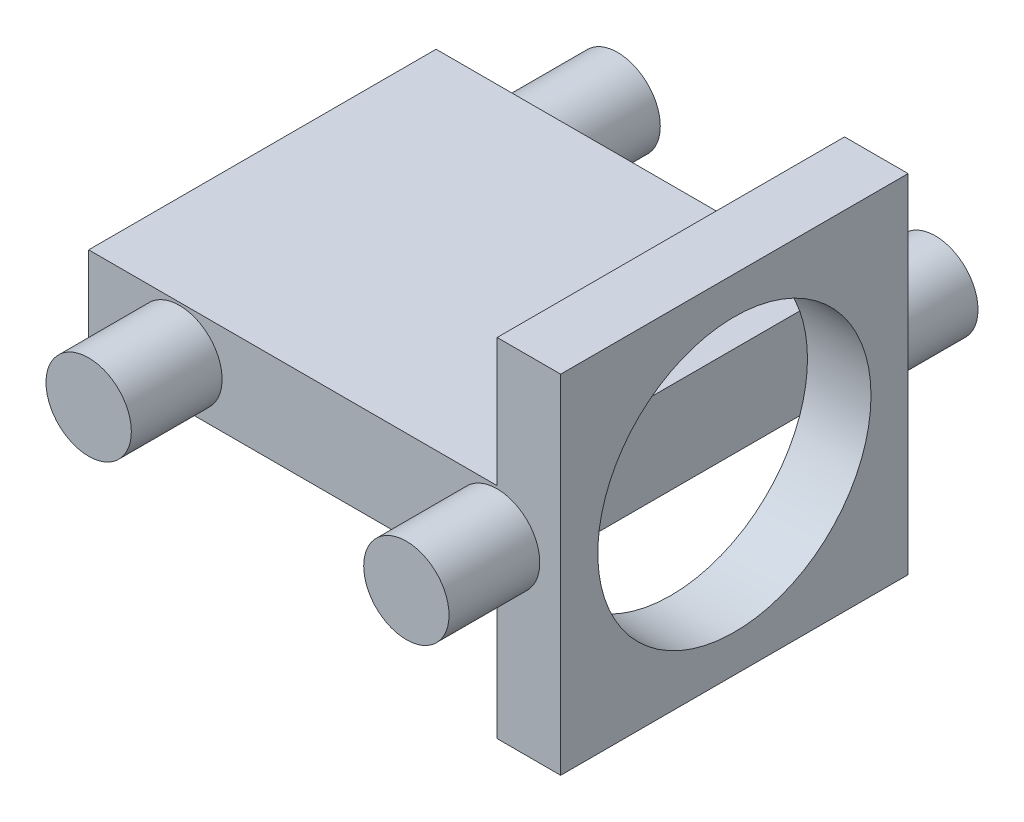
ISO-10303-21;
HEADER;
FILE_DESCRIPTION(('STEP AP214'),'2;1');
FILE_NAME('part.step','',(''),(''),'','','');
FILE_SCHEMA(('AUTOMOTIVE_DESIGN { 1 0 10303 214 1 1 1 1 }'));
ENDSEC;
DATA;
#1=APPLICATION_CONTEXT('core data for automotive mechanical design processes');
#2=APPLICATION_PROTOCOL_DEFINITION('international standard','automotive_design',2000,#1);
#3=PRODUCT_CONTEXT('',#1,'mechanical');
#4=PRODUCT('Part','Part','',(#3));
#5=PRODUCT_RELATED_PRODUCT_CATEGORY('part','',(#4));
#6=PRODUCT_DEFINITION_FORMATION('','',#4);
#7=PRODUCT_DEFINITION_CONTEXT('part definition',#1,'design');
#8=PRODUCT_DEFINITION('design','',#6,#7);
#9=PRODUCT_DEFINITION_SHAPE('','',#8);
#10=(LENGTH_UNIT() NAMED_UNIT(*) SI_UNIT(.MILLI.,.METRE.));
#11=(NAMED_UNIT(*) PLANE_ANGLE_UNIT() SI_UNIT($,.RADIAN.));
#12=(NAMED_UNIT(*) SI_UNIT($,.STERADIAN.) SOLID_ANGLE_UNIT());
#13=UNCERTAINTY_MEASURE_WITH_UNIT(LENGTH_MEASURE(1.E-05),#10,'distance_accuracy_value','');
#14=(GEOMETRIC_REPRESENTATION_CONTEXT(3) GLOBAL_UNCERTAINTY_ASSIGNED_CONTEXT((#13)) GLOBAL_UNIT_ASSIGNED_CONTEXT((#10,
#11,#12)) REPRESENTATION_CONTEXT('',''));
#15=CARTESIAN_POINT('',(0.,0.,0.));
#16=DIRECTION('',(0.,0.,1.));
#17=DIRECTION('',(1.,0.,0.));
#18=AXIS2_PLACEMENT_3D('',#15,#16,#17);
#19=CARTESIAN_POINT('',(0.,0.,0.));
#20=DIRECTION('',(-1.,0.,0.));
#21=DIRECTION('',(0.,0.,1.));
#22=AXIS2_PLACEMENT_3D('',#19,#20,#21);
#23=PLANE('',#22);
#24=DIRECTION('',(0.,0.,1.));
#25=VECTOR('',#24,1.);
#26=CARTESIAN_POINT('',(0.,-5.,-19.1375));
#27=LINE('',#26,#25);
#28=CARTESIAN_POINT('',(0.,-5.,-19.1375));
#29=VERTEX_POINT('',#28);
#30=CARTESIAN_POINT('',(0.,-5.,-14.1951576250495));
#31=VERTEX_POINT('',#30);
#32=EDGE_CURVE('E147',#29,#31,#27,.T.);
#33=ORIENTED_EDGE('',*,*,#32,.F.);
#34=DIRECTION('',(0.,1.,0.));
#35=VECTOR('',#34,1.);
#36=CARTESIAN_POINT('',(0.,-19.1375,-19.1375));
#37=LINE('',#36,#35);
#38=CARTESIAN_POINT('',(0.,-19.1375,-19.1375));
#39=VERTEX_POINT('',#38);
#40=EDGE_CURVE('E187',#39,#29,#37,.T.);
#41=ORIENTED_EDGE('',*,*,#40,.F.);
#42=DIRECTION('',(0.,0.,-1.));
#43=VECTOR('',#42,1.);
#44=CARTESIAN_POINT('',(0.,-19.1375,19.1375));
#45=LINE('',#44,#43);
#46=CARTESIAN_POINT('',(0.,-19.1375,19.1375));
#47=VERTEX_POINT('',#46);
#48=EDGE_CURVE('E177',#47,#39,#45,.T.);
#49=ORIENTED_EDGE('',*,*,#48,.F.);
#50=DIRECTION('',(0.,-1.,0.));
#51=VECTOR('',#50,1.);
#52=CARTESIAN_POINT('',(0.,-19.1375,19.1375));
#53=LINE('',#52,#51);
#54=CARTESIAN_POINT('',(0.,-5.,19.1375));
#55=VERTEX_POINT('',#54);
#56=EDGE_CURVE('E194',#55,#47,#53,.T.);
#57=ORIENTED_EDGE('',*,*,#56,.F.);
#58=CARTESIAN_POINT('',(0.,-5.,14.1951576250495));
#59=VERTEX_POINT('',#58);
#60=EDGE_CURVE('E68',#59,#55,#27,.T.);
#61=ORIENTED_EDGE('',*,*,#60,.F.);
#62=CARTESIAN_POINT('',(0.,0.,0.));
#63=DIRECTION('',(1.,0.,0.));
#64=DIRECTION('',(0.,0.,-1.));
#65=AXIS2_PLACEMENT_3D('',#62,#63,#64);
#66=CIRCLE('',#65,15.05);
#67=EDGE_CURVE('E158',#59,#31,#66,.T.);
#68=ORIENTED_EDGE('',*,*,#67,.T.);
#69=EDGE_LOOP('',(#33,#41,#49,#57,#61,#68));
#70=FACE_BOUND('',#69,.T.);
#71=ADVANCED_FACE('F45',(#70),#23,.T.);
#72=CARTESIAN_POINT('',(7.,0.,0.));
#73=DIRECTION('',(-1.,0.,0.));
#74=DIRECTION('',(0.,0.,1.));
#75=AXIS2_PLACEMENT_3D('',#72,#73,#74);
#76=PLANE('',#75);
#77=DIRECTION('',(0.,1.,0.));
#78=VECTOR('',#77,1.);
#79=CARTESIAN_POINT('',(7.,-19.1375,-19.1375));
#80=LINE('',#79,#78);
#81=CARTESIAN_POINT('',(7.,-19.1375,-19.1375));
#82=VERTEX_POINT('',#81);
#83=CARTESIAN_POINT('',(7.,19.1375,-19.1375));
#84=VERTEX_POINT('',#83);
#85=EDGE_CURVE('E172',#82,#84,#80,.T.);
#86=ORIENTED_EDGE('',*,*,#85,.T.);
#87=DIRECTION('',(0.,0.,1.));
#88=VECTOR('',#87,1.);
#89=CARTESIAN_POINT('',(7.,19.1375,19.1375));
#90=LINE('',#89,#88);
#91=CARTESIAN_POINT('',(7.,19.1375,19.1375));
#92=VERTEX_POINT('',#91);
#93=EDGE_CURVE('E176',#84,#92,#90,.T.);
#94=ORIENTED_EDGE('',*,*,#93,.T.);
#95=DIRECTION('',(0.,-1.,0.));
#96=VECTOR('',#95,1.);
#97=CARTESIAN_POINT('',(7.,-19.1375,19.1375));
#98=LINE('',#97,#96);
#99=CARTESIAN_POINT('',(7.,-19.1375,19.1375));
#100=VERTEX_POINT('',#99);
#101=EDGE_CURVE('E180',#92,#100,#98,.T.);
#102=ORIENTED_EDGE('',*,*,#101,.T.);
#103=DIRECTION('',(0.,0.,-1.));
#104=VECTOR('',#103,1.);
#105=CARTESIAN_POINT('',(7.,-19.1375,19.1375));
#106=LINE('',#105,#104);
#107=EDGE_CURVE('E183',#100,#82,#106,.T.);
#108=ORIENTED_EDGE('',*,*,#107,.T.);
#109=EDGE_LOOP('',(#86,#94,#102,#108));
#110=FACE_BOUND('',#109,.T.);
#111=CARTESIAN_POINT('',(7.,0.,0.));
#112=DIRECTION('',(1.,0.,0.));
#113=DIRECTION('',(0.,0.,-1.));
#114=AXIS2_PLACEMENT_3D('',#111,#112,#113);
#115=CIRCLE('',#114,15.05);
#116=CARTESIAN_POINT('',(7.,0.,-15.05));
#117=VERTEX_POINT('',#116);
#118=EDGE_CURVE('E165',#117,#117,#115,.T.);
#119=ORIENTED_EDGE('',*,*,#118,.F.);
#120=EDGE_LOOP('',(#119));
#121=FACE_BOUND('',#120,.T.);
#122=ADVANCED_FACE('F277',(#110,#121),#76,.F.);
#123=DIRECTION('',(0.,0.,-1.));
#124=VECTOR('',#123,1.);
#125=CARTESIAN_POINT('',(0.,5.,-19.1375));
#126=LINE('',#125,#124);
#127=CARTESIAN_POINT('',(0.,5.,19.1375));
#128=VERTEX_POINT('',#127);
#129=CARTESIAN_POINT('',(0.,5.,14.1951576250495));
#130=VERTEX_POINT('',#129);
#131=EDGE_CURVE('E224',#128,#130,#126,.T.);
#132=ORIENTED_EDGE('',*,*,#131,.F.);
#133=CARTESIAN_POINT('',(0.,19.1375,19.1375));
#134=VERTEX_POINT('',#133);
#135=EDGE_CURVE('E153',#134,#128,#53,.T.);
#136=ORIENTED_EDGE('',*,*,#135,.F.);
#137=DIRECTION('',(0.,0.,1.));
#138=VECTOR('',#137,1.);
#139=CARTESIAN_POINT('',(0.,19.1375,19.1375));
#140=LINE('',#139,#138);
#141=CARTESIAN_POINT('',(0.,19.1375,-19.1375));
#142=VERTEX_POINT('',#141);
#143=EDGE_CURVE('E191',#142,#134,#140,.T.);
#144=ORIENTED_EDGE('',*,*,#143,.F.);
#145=CARTESIAN_POINT('',(0.,5.,-19.1375));
#146=VERTEX_POINT('',#145);
#147=EDGE_CURVE('E168',#146,#142,#37,.T.);
#148=ORIENTED_EDGE('',*,*,#147,.F.);
#149=CARTESIAN_POINT('',(0.,5.,-14.1951576250495));
#150=VERTEX_POINT('',#149);
#151=EDGE_CURVE('E212',#150,#146,#126,.T.);
#152=ORIENTED_EDGE('',*,*,#151,.F.);
#153=EDGE_CURVE('E160',#150,#130,#66,.T.);
#154=ORIENTED_EDGE('',*,*,#153,.T.);
#155=EDGE_LOOP('',(#132,#136,#144,#148,#152,#154));
#156=FACE_BOUND('',#155,.T.);
#157=ADVANCED_FACE('F279',(#156),#23,.T.);
#158=CARTESIAN_POINT('',(7.,-19.1375,-19.1375));
#159=DIRECTION('',(0.,0.,1.));
#160=DIRECTION('',(1.,0.,0.));
#161=AXIS2_PLACEMENT_3D('',#158,#159,#160);
#162=PLANE('',#161);
#163=CARTESIAN_POINT('',(0.,0.,-19.1375));
#164=DIRECTION('',(0.,0.,1.));
#165=DIRECTION('',(1.,0.,0.));
#166=AXIS2_PLACEMENT_3D('',#163,#164,#165);
#167=CIRCLE('',#166,4.7);
#168=CARTESIAN_POINT('',(4.7,0.,-19.1375));
#169=VERTEX_POINT('',#168);
#170=EDGE_CURVE('E257',#169,#169,#167,.T.);
#171=ORIENTED_EDGE('',*,*,#170,.T.);
#172=EDGE_LOOP('',(#171));
#173=FACE_BOUND('',#172,.T.);
#174=CARTESIAN_POINT('',(-35.,0.,-19.1375));
#175=DIRECTION('',(0.,0.,1.));
#176=DIRECTION('',(1.,0.,0.));
#177=AXIS2_PLACEMENT_3D('',#174,#175,#176);
#178=CIRCLE('',#177,4.7);
#179=CARTESIAN_POINT('',(-30.3,0.,-19.1375));
#180=VERTEX_POINT('',#179);
#181=EDGE_CURVE('E249',#180,#180,#178,.T.);
#182=ORIENTED_EDGE('',*,*,#181,.T.);
#183=EDGE_LOOP('',(#182));
#184=FACE_BOUND('',#183,.T.);
#185=ORIENTED_EDGE('',*,*,#40,.T.);
#186=DIRECTION('',(1.,0.,0.));
#187=VECTOR('',#186,1.);
#188=CARTESIAN_POINT('',(-45.,-5.,-19.1375));
#189=LINE('',#188,#187);
#190=CARTESIAN_POINT('',(-45.,-5.,-19.1375));
#191=VERTEX_POINT('',#190);
#192=EDGE_CURVE('E161',#191,#29,#189,.T.);
#193=ORIENTED_EDGE('',*,*,#192,.F.);
#194=DIRECTION('',(0.,-1.,0.));
#195=VECTOR('',#194,1.);
#196=CARTESIAN_POINT('',(-45.,-5.,-19.1375));
#197=LINE('',#196,#195);
#198=CARTESIAN_POINT('',(-45.,5.,-19.1375));
#199=VERTEX_POINT('',#198);
#200=EDGE_CURVE('E136',#199,#191,#197,.T.);
#201=ORIENTED_EDGE('',*,*,#200,.F.);
#202=DIRECTION('',(1.,0.,0.));
#203=VECTOR('',#202,1.);
#204=CARTESIAN_POINT('',(-45.,5.,-19.1375));
#205=LINE('',#204,#203);
#206=EDGE_CURVE('E132',#199,#146,#205,.T.);
#207=ORIENTED_EDGE('',*,*,#206,.T.);
#208=ORIENTED_EDGE('',*,*,#147,.T.);
#209=DIRECTION('',(-1.,0.,0.));
#210=VECTOR('',#209,1.);
#211=CARTESIAN_POINT('',(7.,19.1375,-19.1375));
#212=LINE('',#211,#210);
#213=EDGE_CURVE('E209',#84,#142,#212,.T.);
#214=ORIENTED_EDGE('',*,*,#213,.F.);
#215=ORIENTED_EDGE('',*,*,#85,.F.);
#216=DIRECTION('',(-1.,0.,0.));
#217=VECTOR('',#216,1.);
#218=CARTESIAN_POINT('',(7.,-19.1375,-19.1375));
#219=LINE('',#218,#217);
#220=EDGE_CURVE('E186',#82,#39,#219,.T.);
#221=ORIENTED_EDGE('',*,*,#220,.T.);
#222=EDGE_LOOP('',(#185,#193,#201,#207,#208,#214,#215,#221));
#223=FACE_BOUND('',#222,.T.);
#224=ADVANCED_FACE('F47',(#173,#184,#223),#162,.F.);
#225=CARTESIAN_POINT('',(7.,19.1375,19.1375));
#226=DIRECTION('',(0.,-1.,0.));
#227=DIRECTION('',(0.,0.,-1.));
#228=AXIS2_PLACEMENT_3D('',#225,#226,#227);
#229=PLANE('',#228);
#230=ORIENTED_EDGE('',*,*,#143,.T.);
#231=DIRECTION('',(-1.,0.,0.));
#232=VECTOR('',#231,1.);
#233=CARTESIAN_POINT('',(7.,19.1375,19.1375));
#234=LINE('',#233,#232);
#235=EDGE_CURVE('E206',#92,#134,#234,.T.);
#236=ORIENTED_EDGE('',*,*,#235,.F.);
#237=ORIENTED_EDGE('',*,*,#93,.F.);
#238=ORIENTED_EDGE('',*,*,#213,.T.);
#239=EDGE_LOOP('',(#230,#236,#237,#238));
#240=FACE_BOUND('',#239,.T.);
#241=ADVANCED_FACE('F293',(#240),#229,.F.);
#242=CARTESIAN_POINT('',(7.,-19.1375,19.1375));
#243=DIRECTION('',(0.,0.,-1.));
#244=DIRECTION('',(-1.,0.,0.));
#245=AXIS2_PLACEMENT_3D('',#242,#243,#244);
#246=PLANE('',#245);
#247=CARTESIAN_POINT('',(0.,0.,19.1375));
#248=DIRECTION('',(0.,0.,-1.));
#249=DIRECTION('',(-1.,0.,0.));
#250=AXIS2_PLACEMENT_3D('',#247,#248,#249);
#251=CIRCLE('',#250,4.7);
#252=CARTESIAN_POINT('',(-4.7,0.,19.1375));
#253=VERTEX_POINT('',#252);
#254=EDGE_CURVE('E11',#253,#253,#251,.F.);
#255=ORIENTED_EDGE('',*,*,#254,.F.);
#256=EDGE_LOOP('',(#255));
#257=FACE_BOUND('',#256,.T.);
#258=CARTESIAN_POINT('',(-35.,0.,19.1375));
#259=DIRECTION('',(0.,0.,-1.));
#260=DIRECTION('',(-1.,0.,0.));
#261=AXIS2_PLACEMENT_3D('',#258,#259,#260);
#262=CIRCLE('',#261,4.7);
#263=CARTESIAN_POINT('',(-39.7,0.,19.1375));
#264=VERTEX_POINT('',#263);
#265=EDGE_CURVE('E54',#264,#264,#262,.F.);
#266=ORIENTED_EDGE('',*,*,#265,.F.);
#267=EDGE_LOOP('',(#266));
#268=FACE_BOUND('',#267,.T.);
#269=ORIENTED_EDGE('',*,*,#135,.T.);
#270=DIRECTION('',(1.,0.,0.));
#271=VECTOR('',#270,1.);
#272=CARTESIAN_POINT('',(-45.,5.,19.1375));
#273=LINE('',#272,#271);
#274=CARTESIAN_POINT('',(-45.,5.,19.1375));
#275=VERTEX_POINT('',#274);
#276=EDGE_CURVE('E129',#275,#128,#273,.T.);
#277=ORIENTED_EDGE('',*,*,#276,.F.);
#278=DIRECTION('',(0.,1.,0.));
#279=VECTOR('',#278,1.);
#280=CARTESIAN_POINT('',(-45.,-5.,19.1375));
#281=LINE('',#280,#279);
#282=CARTESIAN_POINT('',(-45.,-5.,19.1375));
#283=VERTEX_POINT('',#282);
#284=EDGE_CURVE('E137',#283,#275,#281,.T.);
#285=ORIENTED_EDGE('',*,*,#284,.F.);
#286=DIRECTION('',(1.,0.,0.));
#287=VECTOR('',#286,1.);
#288=CARTESIAN_POINT('',(-45.,-5.,19.1375));
#289=LINE('',#288,#287);
#290=EDGE_CURVE('E238',#283,#55,#289,.T.);
#291=ORIENTED_EDGE('',*,*,#290,.T.);
#292=ORIENTED_EDGE('',*,*,#56,.T.);
#293=DIRECTION('',(-1.,0.,0.));
#294=VECTOR('',#293,1.);
#295=CARTESIAN_POINT('',(7.,-19.1375,19.1375));
#296=LINE('',#295,#294);
#297=EDGE_CURVE('E202',#100,#47,#296,.T.);
#298=ORIENTED_EDGE('',*,*,#297,.F.);
#299=ORIENTED_EDGE('',*,*,#101,.F.);
#300=ORIENTED_EDGE('',*,*,#235,.T.);
#301=EDGE_LOOP('',(#269,#277,#285,#291,#292,#298,#299,#300));
#302=FACE_BOUND('',#301,.T.);
#303=ADVANCED_FACE('F150',(#257,#268,#302),#246,.F.);
#304=CARTESIAN_POINT('',(7.,-19.1375,19.1375));
#305=DIRECTION('',(0.,1.,0.));
#306=DIRECTION('',(0.,0.,1.));
#307=AXIS2_PLACEMENT_3D('',#304,#305,#306);
#308=PLANE('',#307);
#309=ORIENTED_EDGE('',*,*,#48,.T.);
#310=ORIENTED_EDGE('',*,*,#220,.F.);
#311=ORIENTED_EDGE('',*,*,#107,.F.);
#312=ORIENTED_EDGE('',*,*,#297,.T.);
#313=EDGE_LOOP('',(#309,#310,#311,#312));
#314=FACE_BOUND('',#313,.T.);
#315=ADVANCED_FACE('F317',(#314),#308,.F.);
#316=CARTESIAN_POINT('',(7.,0.,0.));
#317=DIRECTION('',(-1.,0.,0.));
#318=DIRECTION('',(0.,0.,1.));
#319=AXIS2_PLACEMENT_3D('',#316,#317,#318);
#320=CYLINDRICAL_SURFACE('',#319,15.05);
#321=ORIENTED_EDGE('',*,*,#118,.T.);
#322=EDGE_LOOP('',(#321));
#323=FACE_BOUND('',#322,.T.);
#324=ORIENTED_EDGE('',*,*,#153,.F.);
#325=EDGE_CURVE('E61',#31,#150,#66,.T.);
#326=ORIENTED_EDGE('',*,*,#325,.F.);
#327=ORIENTED_EDGE('',*,*,#67,.F.);
#328=EDGE_CURVE('E171',#130,#59,#66,.T.);
#329=ORIENTED_EDGE('',*,*,#328,.F.);
#330=EDGE_LOOP('',(#324,#326,#327,#329));
#331=FACE_BOUND('',#330,.T.);
#332=ADVANCED_FACE('F299',(#323,#331),#320,.F.);
#333=CARTESIAN_POINT('',(-45.,5.,-19.1375));
#334=DIRECTION('',(0.,-1.,0.));
#335=DIRECTION('',(0.,0.,-1.));
#336=AXIS2_PLACEMENT_3D('',#333,#334,#335);
#337=PLANE('',#336);
#338=ORIENTED_EDGE('',*,*,#131,.T.);
#339=EDGE_CURVE('E225',#130,#150,#126,.T.);
#340=ORIENTED_EDGE('',*,*,#339,.T.);
#341=ORIENTED_EDGE('',*,*,#151,.T.);
#342=ORIENTED_EDGE('',*,*,#206,.F.);
#343=DIRECTION('',(0.,0.,-1.));
#344=VECTOR('',#343,1.);
#345=CARTESIAN_POINT('',(-45.,5.,-19.1375));
#346=LINE('',#345,#344);
#347=EDGE_CURVE('E124',#275,#199,#346,.T.);
#348=ORIENTED_EDGE('',*,*,#347,.F.);
#349=ORIENTED_EDGE('',*,*,#276,.T.);
#350=EDGE_LOOP('',(#338,#340,#341,#342,#348,#349));
#351=FACE_BOUND('',#350,.T.);
#352=ADVANCED_FACE('F127',(#351),#337,.F.);
#353=CARTESIAN_POINT('',(-45.,-5.,-19.1375));
#354=DIRECTION('',(0.,1.,0.));
#355=DIRECTION('',(0.,0.,1.));
#356=AXIS2_PLACEMENT_3D('',#353,#354,#355);
#357=PLANE('',#356);
#358=ORIENTED_EDGE('',*,*,#32,.T.);
#359=EDGE_CURVE('E219',#31,#59,#27,.T.);
#360=ORIENTED_EDGE('',*,*,#359,.T.);
#361=ORIENTED_EDGE('',*,*,#60,.T.);
#362=ORIENTED_EDGE('',*,*,#290,.F.);
#363=DIRECTION('',(0.,0.,1.));
#364=VECTOR('',#363,1.);
#365=CARTESIAN_POINT('',(-45.,-5.,-19.1375));
#366=LINE('',#365,#364);
#367=EDGE_CURVE('E142',#191,#283,#366,.T.);
#368=ORIENTED_EDGE('',*,*,#367,.F.);
#369=ORIENTED_EDGE('',*,*,#192,.T.);
#370=EDGE_LOOP('',(#358,#360,#361,#362,#368,#369));
#371=FACE_BOUND('',#370,.T.);
#372=ADVANCED_FACE('F309',(#371),#357,.F.);
#373=CARTESIAN_POINT('',(-45.,0.,0.));
#374=DIRECTION('',(1.,0.,0.));
#375=DIRECTION('',(0.,0.,-1.));
#376=AXIS2_PLACEMENT_3D('',#373,#374,#375);
#377=PLANE('',#376);
#378=ORIENTED_EDGE('',*,*,#284,.T.);
#379=ORIENTED_EDGE('',*,*,#347,.T.);
#380=ORIENTED_EDGE('',*,*,#200,.T.);
#381=ORIENTED_EDGE('',*,*,#367,.T.);
#382=EDGE_LOOP('',(#378,#379,#380,#381));
#383=FACE_BOUND('',#382,.T.);
#384=ADVANCED_FACE('F140',(#383),#377,.F.);
#385=CARTESIAN_POINT('',(0.,0.,0.));
#386=DIRECTION('',(1.,0.,0.));
#387=DIRECTION('',(0.,0.,-1.));
#388=AXIS2_PLACEMENT_3D('',#385,#386,#387);
#389=PLANE('',#388);
#390=ORIENTED_EDGE('',*,*,#339,.F.);
#391=ORIENTED_EDGE('',*,*,#328,.T.);
#392=ORIENTED_EDGE('',*,*,#359,.F.);
#393=ORIENTED_EDGE('',*,*,#325,.T.);
#394=EDGE_LOOP('',(#390,#391,#392,#393));
#395=FACE_BOUND('',#394,.T.);
#396=ADVANCED_FACE('F302',(#395),#389,.T.);
#397=CARTESIAN_POINT('',(-35.,0.,29.1375));
#398=DIRECTION('',(0.,0.,-1.));
#399=DIRECTION('',(-1.,0.,0.));
#400=AXIS2_PLACEMENT_3D('',#397,#398,#399);
#401=CYLINDRICAL_SURFACE('',#400,4.7);
#402=CARTESIAN_POINT('',(-35.,0.,29.1375));
#403=DIRECTION('',(0.,0.,1.));
#404=DIRECTION('',(1.,0.,0.));
#405=AXIS2_PLACEMENT_3D('',#402,#403,#404);
#406=CIRCLE('',#405,4.7);
#407=CARTESIAN_POINT('',(-30.3,0.,29.1375));
#408=VERTEX_POINT('',#407);
#409=EDGE_CURVE('E234',#408,#408,#406,.T.);
#410=ORIENTED_EDGE('',*,*,#409,.F.);
#411=EDGE_LOOP('',(#410));
#412=FACE_BOUND('',#411,.T.);
#413=ORIENTED_EDGE('',*,*,#265,.T.);
#414=EDGE_LOOP('',(#413));
#415=FACE_BOUND('',#414,.T.);
#416=ADVANCED_FACE('F344',(#412,#415),#401,.T.);
#417=CARTESIAN_POINT('',(-35.,0.,29.1375));
#418=DIRECTION('',(0.,0.,1.));
#419=DIRECTION('',(1.,0.,0.));
#420=AXIS2_PLACEMENT_3D('',#417,#418,#419);
#421=PLANE('',#420);
#422=ORIENTED_EDGE('',*,*,#409,.T.);
#423=EDGE_LOOP('',(#422));
#424=FACE_BOUND('',#423,.T.);
#425=ADVANCED_FACE('F349',(#424),#421,.T.);
#426=CARTESIAN_POINT('',(0.,0.,29.1375));
#427=DIRECTION('',(0.,0.,-1.));
#428=DIRECTION('',(-1.,0.,0.));
#429=AXIS2_PLACEMENT_3D('',#426,#427,#428);
#430=CYLINDRICAL_SURFACE('',#429,4.7);
#431=CARTESIAN_POINT('',(0.,0.,29.1375));
#432=DIRECTION('',(0.,0.,1.));
#433=DIRECTION('',(1.,0.,0.));
#434=AXIS2_PLACEMENT_3D('',#431,#432,#433);
#435=CIRCLE('',#434,4.7);
#436=CARTESIAN_POINT('',(4.7,0.,29.1375));
#437=VERTEX_POINT('',#436);
#438=EDGE_CURVE('E244',#437,#437,#435,.T.);
#439=ORIENTED_EDGE('',*,*,#438,.F.);
#440=EDGE_LOOP('',(#439));
#441=FACE_BOUND('',#440,.T.);
#442=ORIENTED_EDGE('',*,*,#254,.T.);
#443=EDGE_LOOP('',(#442));
#444=FACE_BOUND('',#443,.T.);
#445=ADVANCED_FACE('F353',(#441,#444),#430,.T.);
#446=CARTESIAN_POINT('',(0.,0.,29.1375));
#447=DIRECTION('',(0.,0.,1.));
#448=DIRECTION('',(1.,0.,0.));
#449=AXIS2_PLACEMENT_3D('',#446,#447,#448);
#450=PLANE('',#449);
#451=ORIENTED_EDGE('',*,*,#438,.T.);
#452=EDGE_LOOP('',(#451));
#453=FACE_BOUND('',#452,.T.);
#454=ADVANCED_FACE('F355',(#453),#450,.T.);
#455=CARTESIAN_POINT('',(-35.,0.,-29.1375));
#456=DIRECTION('',(0.,0.,1.));
#457=DIRECTION('',(1.,0.,0.));
#458=AXIS2_PLACEMENT_3D('',#455,#456,#457);
#459=CYLINDRICAL_SURFACE('',#458,4.7);
#460=CARTESIAN_POINT('',(-35.,0.,-29.1375));
#461=DIRECTION('',(0.,0.,1.));
#462=DIRECTION('',(1.,0.,0.));
#463=AXIS2_PLACEMENT_3D('',#460,#461,#462);
#464=CIRCLE('',#463,4.7);
#465=CARTESIAN_POINT('',(-30.3,0.,-29.1375));
#466=VERTEX_POINT('',#465);
#467=EDGE_CURVE('E248',#466,#466,#464,.T.);
#468=ORIENTED_EDGE('',*,*,#467,.T.);
#469=EDGE_LOOP('',(#468));
#470=FACE_BOUND('',#469,.T.);
#471=ORIENTED_EDGE('',*,*,#181,.F.);
#472=EDGE_LOOP('',(#471));
#473=FACE_BOUND('',#472,.T.);
#474=ADVANCED_FACE('F358',(#470,#473),#459,.T.);
#475=CARTESIAN_POINT('',(-35.,0.,-29.1375));
#476=DIRECTION('',(0.,0.,-1.));
#477=DIRECTION('',(1.,0.,0.));
#478=AXIS2_PLACEMENT_3D('',#475,#476,#477);
#479=PLANE('',#478);
#480=ORIENTED_EDGE('',*,*,#467,.F.);
#481=EDGE_LOOP('',(#480));
#482=FACE_BOUND('',#481,.T.);
#483=ADVANCED_FACE('F274',(#482),#479,.T.);
#484=CARTESIAN_POINT('',(0.,0.,-29.1375));
#485=DIRECTION('',(0.,0.,1.));
#486=DIRECTION('',(1.,0.,0.));
#487=AXIS2_PLACEMENT_3D('',#484,#485,#486);
#488=CYLINDRICAL_SURFACE('',#487,4.7);
#489=CARTESIAN_POINT('',(0.,0.,-29.1375));
#490=DIRECTION('',(0.,0.,1.));
#491=DIRECTION('',(1.,0.,0.));
#492=AXIS2_PLACEMENT_3D('',#489,#490,#491);
#493=CIRCLE('',#492,4.7);
#494=CARTESIAN_POINT('',(4.7,0.,-29.1375));
#495=VERTEX_POINT('',#494);
#496=EDGE_CURVE('E253',#495,#495,#493,.T.);
#497=ORIENTED_EDGE('',*,*,#496,.T.);
#498=EDGE_LOOP('',(#497));
#499=FACE_BOUND('',#498,.T.);
#500=ORIENTED_EDGE('',*,*,#170,.F.);
#501=EDGE_LOOP('',(#500));
#502=FACE_BOUND('',#501,.T.);
#503=ADVANCED_FACE('F265',(#499,#502),#488,.T.);
#504=CARTESIAN_POINT('',(0.,0.,-29.1375));
#505=DIRECTION('',(0.,0.,-1.));
#506=DIRECTION('',(1.,0.,0.));
#507=AXIS2_PLACEMENT_3D('',#504,#505,#506);
#508=PLANE('',#507);
#509=ORIENTED_EDGE('',*,*,#496,.F.);
#510=EDGE_LOOP('',(#509));
#511=FACE_BOUND('',#510,.T.);
#512=ADVANCED_FACE('F268',(#511),#508,.T.);
#513=CLOSED_SHELL('',(#71,#122,#157,#224,#241,#303,#315,#332,#352,#372,#384,#396,#416,#425,#445,
#454,#474,#483,#503,#512));
#514=MANIFOLD_SOLID_BREP('B2',#513);
#515=ADVANCED_BREP_SHAPE_REPRESENTATION('',(#18,#514),#14);
#516=SHAPE_DEFINITION_REPRESENTATION(#9,#515);
ENDSEC;
END-ISO-10303-21;
